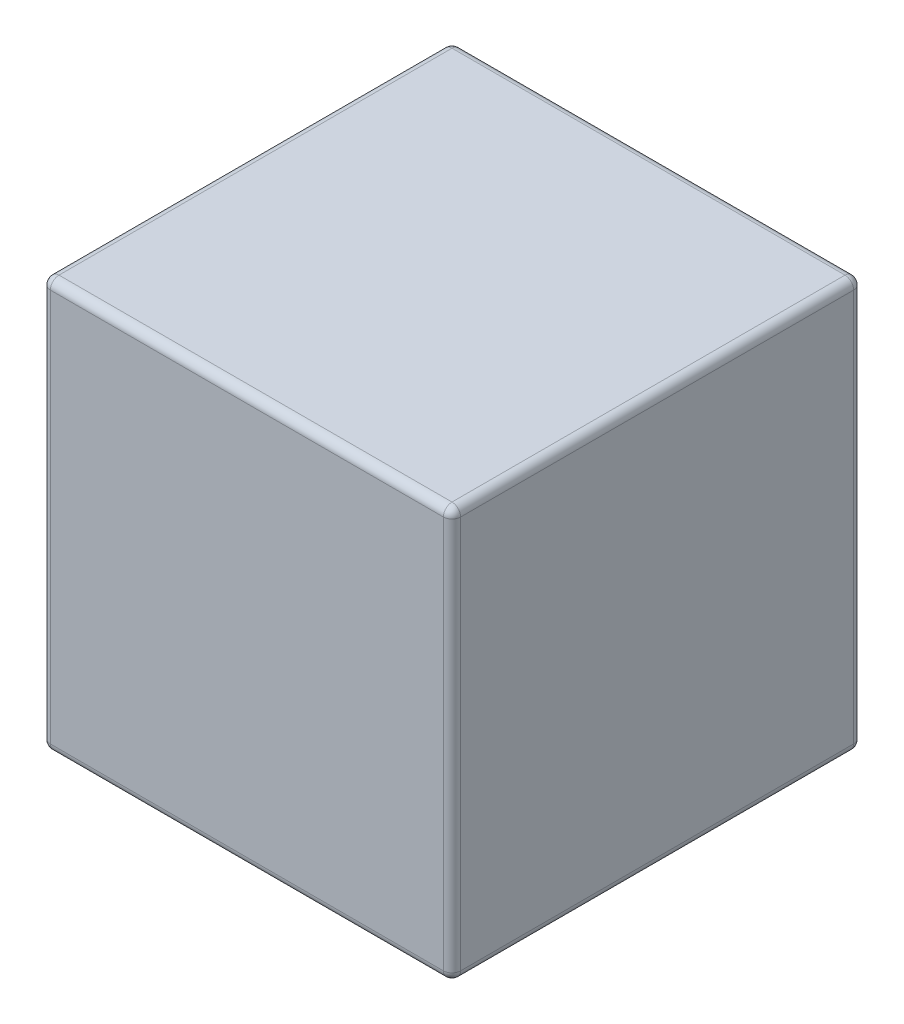
ISO-10303-21;
HEADER;
FILE_DESCRIPTION(('STEP AP214'),'2;1');
FILE_NAME('part.step','',(''),(''),'','','');
FILE_SCHEMA(('AUTOMOTIVE_DESIGN { 1 0 10303 214 1 1 1 1 }'));
ENDSEC;
DATA;
#1=APPLICATION_CONTEXT('core data for automotive mechanical design processes');
#2=APPLICATION_PROTOCOL_DEFINITION('international standard','automotive_design',2000,#1);
#3=PRODUCT_CONTEXT('',#1,'mechanical');
#4=PRODUCT('Part','Part','',(#3));
#5=PRODUCT_RELATED_PRODUCT_CATEGORY('part','',(#4));
#6=PRODUCT_DEFINITION_FORMATION('','',#4);
#7=PRODUCT_DEFINITION_CONTEXT('part definition',#1,'design');
#8=PRODUCT_DEFINITION('design','',#6,#7);
#9=PRODUCT_DEFINITION_SHAPE('','',#8);
#10=(LENGTH_UNIT() NAMED_UNIT(*) SI_UNIT(.MILLI.,.METRE.));
#11=(NAMED_UNIT(*) PLANE_ANGLE_UNIT() SI_UNIT($,.RADIAN.));
#12=(NAMED_UNIT(*) SI_UNIT($,.STERADIAN.) SOLID_ANGLE_UNIT());
#13=UNCERTAINTY_MEASURE_WITH_UNIT(LENGTH_MEASURE(1.E-05),#10,'distance_accuracy_value','');
#14=(GEOMETRIC_REPRESENTATION_CONTEXT(3) GLOBAL_UNCERTAINTY_ASSIGNED_CONTEXT((#13)) GLOBAL_UNIT_ASSIGNED_CONTEXT((#10,
#11,#12)) REPRESENTATION_CONTEXT('',''));
#15=CARTESIAN_POINT('',(0.,0.,0.));
#16=DIRECTION('',(0.,0.,1.));
#17=DIRECTION('',(1.,0.,0.));
#18=AXIS2_PLACEMENT_3D('',#15,#16,#17);
#19=CARTESIAN_POINT('',(47.5,95.,47.5));
#20=DIRECTION('',(-1.,0.,0.));
#21=DIRECTION('',(0.,0.,1.));
#22=AXIS2_PLACEMENT_3D('',#19,#20,#21);
#23=PLANE('',#22);
#24=DIRECTION('',(0.,0.,-1.));
#25=VECTOR('',#24,1.);
#26=CARTESIAN_POINT('',(47.5,93.,47.5));
#27=LINE('',#26,#25);
#28=CARTESIAN_POINT('',(47.5,93.,-45.5));
#29=VERTEX_POINT('',#28);
#30=CARTESIAN_POINT('',(47.5,93.,45.5));
#31=VERTEX_POINT('',#30);
#32=EDGE_CURVE('E176',#29,#31,#27,.F.);
#33=ORIENTED_EDGE('',*,*,#32,.T.);
#34=DIRECTION('',(0.,-1.,0.));
#35=VECTOR('',#34,1.);
#36=CARTESIAN_POINT('',(47.5,95.,45.5));
#37=LINE('',#36,#35);
#38=CARTESIAN_POINT('',(47.5,2.,45.5));
#39=VERTEX_POINT('',#38);
#40=EDGE_CURVE('E143',#31,#39,#37,.T.);
#41=ORIENTED_EDGE('',*,*,#40,.T.);
#42=DIRECTION('',(0.,0.,-1.));
#43=VECTOR('',#42,1.);
#44=CARTESIAN_POINT('',(47.5,2.,-47.5));
#45=LINE('',#44,#43);
#46=CARTESIAN_POINT('',(47.5,2.,-45.5));
#47=VERTEX_POINT('',#46);
#48=EDGE_CURVE('E180',#39,#47,#45,.T.);
#49=ORIENTED_EDGE('',*,*,#48,.T.);
#50=DIRECTION('',(0.,-1.,0.));
#51=VECTOR('',#50,1.);
#52=CARTESIAN_POINT('',(47.5,95.,-45.5));
#53=LINE('',#52,#51);
#54=EDGE_CURVE('E178',#47,#29,#53,.F.);
#55=ORIENTED_EDGE('',*,*,#54,.T.);
#56=EDGE_LOOP('',(#33,#41,#49,#55));
#57=FACE_BOUND('',#56,.T.);
#58=ADVANCED_FACE('F35',(#57),#23,.F.);
#59=CARTESIAN_POINT('',(-47.5,95.,-47.5));
#60=DIRECTION('',(0.,0.,1.));
#61=DIRECTION('',(1.,0.,0.));
#62=AXIS2_PLACEMENT_3D('',#59,#60,#61);
#63=PLANE('',#62);
#64=DIRECTION('',(0.,-1.,0.));
#65=VECTOR('',#64,1.);
#66=CARTESIAN_POINT('',(45.5,95.,-47.5));
#67=LINE('',#66,#65);
#68=CARTESIAN_POINT('',(45.5,93.,-47.5));
#69=VERTEX_POINT('',#68);
#70=CARTESIAN_POINT('',(45.5,2.,-47.5));
#71=VERTEX_POINT('',#70);
#72=EDGE_CURVE('E196',#69,#71,#67,.T.);
#73=ORIENTED_EDGE('',*,*,#72,.T.);
#74=DIRECTION('',(-1.,0.,0.));
#75=VECTOR('',#74,1.);
#76=CARTESIAN_POINT('',(-47.5,2.,-47.5));
#77=LINE('',#76,#75);
#78=CARTESIAN_POINT('',(-45.5,2.,-47.5));
#79=VERTEX_POINT('',#78);
#80=EDGE_CURVE('E199',#71,#79,#77,.T.);
#81=ORIENTED_EDGE('',*,*,#80,.T.);
#82=DIRECTION('',(0.,-1.,0.));
#83=VECTOR('',#82,1.);
#84=CARTESIAN_POINT('',(-45.5,95.,-47.5));
#85=LINE('',#84,#83);
#86=CARTESIAN_POINT('',(-45.5,93.,-47.5));
#87=VERTEX_POINT('',#86);
#88=EDGE_CURVE('E194',#79,#87,#85,.F.);
#89=ORIENTED_EDGE('',*,*,#88,.T.);
#90=DIRECTION('',(-1.,0.,0.));
#91=VECTOR('',#90,1.);
#92=CARTESIAN_POINT('',(-47.5,93.,-47.5));
#93=LINE('',#92,#91);
#94=EDGE_CURVE('E192',#87,#69,#93,.F.);
#95=ORIENTED_EDGE('',*,*,#94,.T.);
#96=EDGE_LOOP('',(#73,#81,#89,#95));
#97=FACE_BOUND('',#96,.T.);
#98=ADVANCED_FACE('F277',(#97),#63,.F.);
#99=CARTESIAN_POINT('',(-47.5,95.,47.5));
#100=DIRECTION('',(1.,0.,0.));
#101=DIRECTION('',(0.,0.,-1.));
#102=AXIS2_PLACEMENT_3D('',#99,#100,#101);
#103=PLANE('',#102);
#104=DIRECTION('',(0.,0.,1.));
#105=VECTOR('',#104,1.);
#106=CARTESIAN_POINT('',(-47.5,2.,47.5));
#107=LINE('',#106,#105);
#108=CARTESIAN_POINT('',(-47.5,2.,-45.5));
#109=VERTEX_POINT('',#108);
#110=CARTESIAN_POINT('',(-47.5,2.,45.5));
#111=VERTEX_POINT('',#110);
#112=EDGE_CURVE('E171',#109,#111,#107,.T.);
#113=ORIENTED_EDGE('',*,*,#112,.T.);
#114=DIRECTION('',(0.,-1.,0.));
#115=VECTOR('',#114,1.);
#116=CARTESIAN_POINT('',(-47.5,95.,45.5));
#117=LINE('',#116,#115);
#118=CARTESIAN_POINT('',(-47.5,93.,45.5));
#119=VERTEX_POINT('',#118);
#120=EDGE_CURVE('E173',#111,#119,#117,.F.);
#121=ORIENTED_EDGE('',*,*,#120,.T.);
#122=DIRECTION('',(0.,0.,1.));
#123=VECTOR('',#122,1.);
#124=CARTESIAN_POINT('',(-47.5,93.,47.5));
#125=LINE('',#124,#123);
#126=CARTESIAN_POINT('',(-47.5,93.,-45.5));
#127=VERTEX_POINT('',#126);
#128=EDGE_CURVE('E167',#119,#127,#125,.F.);
#129=ORIENTED_EDGE('',*,*,#128,.T.);
#130=DIRECTION('',(0.,-1.,0.));
#131=VECTOR('',#130,1.);
#132=CARTESIAN_POINT('',(-47.5,95.,-45.5));
#133=LINE('',#132,#131);
#134=EDGE_CURVE('E169',#127,#109,#133,.T.);
#135=ORIENTED_EDGE('',*,*,#134,.T.);
#136=EDGE_LOOP('',(#113,#121,#129,#135));
#137=FACE_BOUND('',#136,.T.);
#138=ADVANCED_FACE('F304',(#137),#103,.F.);
#139=CARTESIAN_POINT('',(-47.5,95.,47.5));
#140=DIRECTION('',(0.,0.,-1.));
#141=DIRECTION('',(-1.,0.,0.));
#142=AXIS2_PLACEMENT_3D('',#139,#140,#141);
#143=PLANE('',#142);
#144=DIRECTION('',(0.,-1.,0.));
#145=VECTOR('',#144,1.);
#146=CARTESIAN_POINT('',(-45.5,95.,47.5));
#147=LINE('',#146,#145);
#148=CARTESIAN_POINT('',(-45.5,93.,47.5));
#149=VERTEX_POINT('',#148);
#150=CARTESIAN_POINT('',(-45.5,2.,47.5));
#151=VERTEX_POINT('',#150);
#152=EDGE_CURVE('E135',#149,#151,#147,.T.);
#153=ORIENTED_EDGE('',*,*,#152,.T.);
#154=DIRECTION('',(1.,0.,0.));
#155=VECTOR('',#154,1.);
#156=CARTESIAN_POINT('',(47.5,2.,47.5));
#157=LINE('',#156,#155);
#158=CARTESIAN_POINT('',(45.5,2.,47.5));
#159=VERTEX_POINT('',#158);
#160=EDGE_CURVE('E131',#151,#159,#157,.T.);
#161=ORIENTED_EDGE('',*,*,#160,.T.);
#162=DIRECTION('',(0.,-1.,0.));
#163=VECTOR('',#162,1.);
#164=CARTESIAN_POINT('',(45.5,95.,47.5));
#165=LINE('',#164,#163);
#166=CARTESIAN_POINT('',(45.5,93.,47.5));
#167=VERTEX_POINT('',#166);
#168=EDGE_CURVE('E123',#159,#167,#165,.F.);
#169=ORIENTED_EDGE('',*,*,#168,.T.);
#170=DIRECTION('',(1.,0.,0.));
#171=VECTOR('',#170,1.);
#172=CARTESIAN_POINT('',(-47.5,93.,47.5));
#173=LINE('',#172,#171);
#174=EDGE_CURVE('E128',#167,#149,#173,.F.);
#175=ORIENTED_EDGE('',*,*,#174,.T.);
#176=EDGE_LOOP('',(#153,#161,#169,#175));
#177=FACE_BOUND('',#176,.T.);
#178=ADVANCED_FACE('F126',(#177),#143,.F.);
#179=CARTESIAN_POINT('',(0.,95.,0.));
#180=DIRECTION('',(0.,-1.,0.));
#181=DIRECTION('',(0.,0.,-1.));
#182=AXIS2_PLACEMENT_3D('',#179,#180,#181);
#183=PLANE('',#182);
#184=DIRECTION('',(0.,0.,1.));
#185=VECTOR('',#184,1.);
#186=CARTESIAN_POINT('',(-45.5,95.,0.));
#187=LINE('',#186,#185);
#188=CARTESIAN_POINT('',(-45.5,95.,-45.5));
#189=VERTEX_POINT('',#188);
#190=CARTESIAN_POINT('',(-45.5,95.,45.5));
#191=VERTEX_POINT('',#190);
#192=EDGE_CURVE('E44',#189,#191,#187,.T.);
#193=ORIENTED_EDGE('',*,*,#192,.T.);
#194=DIRECTION('',(1.,0.,0.));
#195=VECTOR('',#194,1.);
#196=CARTESIAN_POINT('',(0.,95.,45.5));
#197=LINE('',#196,#195);
#198=CARTESIAN_POINT('',(45.5,95.,45.5));
#199=VERTEX_POINT('',#198);
#200=EDGE_CURVE('E11',#191,#199,#197,.T.);
#201=ORIENTED_EDGE('',*,*,#200,.T.);
#202=DIRECTION('',(0.,0.,-1.));
#203=VECTOR('',#202,1.);
#204=CARTESIAN_POINT('',(45.5,95.,0.));
#205=LINE('',#204,#203);
#206=CARTESIAN_POINT('',(45.5,95.,-45.5));
#207=VERTEX_POINT('',#206);
#208=EDGE_CURVE('E201',#199,#207,#205,.T.);
#209=ORIENTED_EDGE('',*,*,#208,.T.);
#210=DIRECTION('',(-1.,0.,0.));
#211=VECTOR('',#210,1.);
#212=CARTESIAN_POINT('',(0.,95.,-45.5));
#213=LINE('',#212,#211);
#214=EDGE_CURVE('E55',#207,#189,#213,.T.);
#215=ORIENTED_EDGE('',*,*,#214,.T.);
#216=EDGE_LOOP('',(#193,#201,#209,#215));
#217=FACE_BOUND('',#216,.T.);
#218=ADVANCED_FACE('F366',(#217),#183,.F.);
#219=CARTESIAN_POINT('',(0.,0.,0.));
#220=DIRECTION('',(0.,-1.,0.));
#221=DIRECTION('',(0.,0.,-1.));
#222=AXIS2_PLACEMENT_3D('',#219,#220,#221);
#223=PLANE('',#222);
#224=DIRECTION('',(1.,0.,0.));
#225=VECTOR('',#224,1.);
#226=CARTESIAN_POINT('',(-47.5,0.,45.5));
#227=LINE('',#226,#225);
#228=CARTESIAN_POINT('',(45.5,0.,45.5));
#229=VERTEX_POINT('',#228);
#230=CARTESIAN_POINT('',(-45.5,0.,45.5));
#231=VERTEX_POINT('',#230);
#232=EDGE_CURVE('E187',#229,#231,#227,.F.);
#233=ORIENTED_EDGE('',*,*,#232,.T.);
#234=DIRECTION('',(0.,0.,1.));
#235=VECTOR('',#234,1.);
#236=CARTESIAN_POINT('',(-45.5,0.,-47.5));
#237=LINE('',#236,#235);
#238=CARTESIAN_POINT('',(-45.5,0.,-45.5));
#239=VERTEX_POINT('',#238);
#240=EDGE_CURVE('E189',#231,#239,#237,.F.);
#241=ORIENTED_EDGE('',*,*,#240,.T.);
#242=DIRECTION('',(-1.,0.,0.));
#243=VECTOR('',#242,1.);
#244=CARTESIAN_POINT('',(47.5,0.,-45.5));
#245=LINE('',#244,#243);
#246=CARTESIAN_POINT('',(45.5,0.,-45.5));
#247=VERTEX_POINT('',#246);
#248=EDGE_CURVE('E183',#239,#247,#245,.F.);
#249=ORIENTED_EDGE('',*,*,#248,.T.);
#250=DIRECTION('',(0.,0.,-1.));
#251=VECTOR('',#250,1.);
#252=CARTESIAN_POINT('',(45.5,0.,47.5));
#253=LINE('',#252,#251);
#254=EDGE_CURVE('E185',#247,#229,#253,.F.);
#255=ORIENTED_EDGE('',*,*,#254,.T.);
#256=EDGE_LOOP('',(#233,#241,#249,#255));
#257=FACE_BOUND('',#256,.T.);
#258=ADVANCED_FACE('F268',(#257),#223,.T.);
#259=CARTESIAN_POINT('',(45.5,95.,-45.5));
#260=DIRECTION('',(0.,-1.,0.));
#261=DIRECTION('',(0.,0.,-1.));
#262=AXIS2_PLACEMENT_3D('',#259,#260,#261);
#263=CYLINDRICAL_SURFACE('',#262,2.);
#264=CARTESIAN_POINT('',(45.5,93.,-45.5));
#265=DIRECTION('',(0.,1.,0.));
#266=DIRECTION('',(0.,0.,1.));
#267=AXIS2_PLACEMENT_3D('',#264,#265,#266);
#268=CIRCLE('',#267,2.);
#269=EDGE_CURVE('E39',#29,#69,#268,.T.);
#270=ORIENTED_EDGE('',*,*,#269,.F.);
#271=ORIENTED_EDGE('',*,*,#54,.F.);
#272=CARTESIAN_POINT('',(45.5,2.,-45.5));
#273=DIRECTION('',(0.,-1.,0.));
#274=DIRECTION('',(0.,0.,-1.));
#275=AXIS2_PLACEMENT_3D('',#272,#273,#274);
#276=CIRCLE('',#275,2.);
#277=EDGE_CURVE('E163',#71,#47,#276,.T.);
#278=ORIENTED_EDGE('',*,*,#277,.F.);
#279=ORIENTED_EDGE('',*,*,#72,.F.);
#280=EDGE_LOOP('',(#270,#271,#278,#279));
#281=FACE_BOUND('',#280,.T.);
#282=ADVANCED_FACE('F37',(#281),#263,.T.);
#283=CARTESIAN_POINT('',(45.5,93.,-45.5));
#284=DIRECTION('',(0.,0.,1.));
#285=DIRECTION('',(1.,0.,0.));
#286=AXIS2_PLACEMENT_3D('',#283,#284,#285);
#287=SPHERICAL_SURFACE('',#286,2.);
#288=CARTESIAN_POINT('',(45.5,93.,-45.5));
#289=DIRECTION('',(0.,0.,-1.));
#290=DIRECTION('',(-1.,0.,0.));
#291=AXIS2_PLACEMENT_3D('',#288,#289,#290);
#292=CIRCLE('',#291,2.);
#293=EDGE_CURVE('E247',#29,#207,#292,.F.);
#294=ORIENTED_EDGE('',*,*,#293,.F.);
#295=ORIENTED_EDGE('',*,*,#269,.T.);
#296=CARTESIAN_POINT('',(45.5,93.,-45.5));
#297=DIRECTION('',(1.,0.,0.));
#298=DIRECTION('',(0.,0.,-1.));
#299=AXIS2_PLACEMENT_3D('',#296,#297,#298);
#300=CIRCLE('',#299,2.);
#301=EDGE_CURVE('E250',#207,#69,#300,.F.);
#302=ORIENTED_EDGE('',*,*,#301,.F.);
#303=EDGE_LOOP('',(#294,#295,#302));
#304=FACE_BOUND('',#303,.T.);
#305=ADVANCED_FACE('F294',(#304),#287,.T.);
#306=CARTESIAN_POINT('',(45.5,2.,-45.5));
#307=DIRECTION('',(0.,0.,1.));
#308=DIRECTION('',(1.,0.,0.));
#309=AXIS2_PLACEMENT_3D('',#306,#307,#308);
#310=SPHERICAL_SURFACE('',#309,2.);
#311=CARTESIAN_POINT('',(45.5,2.,-45.5));
#312=DIRECTION('',(1.,0.,0.));
#313=DIRECTION('',(0.,0.,-1.));
#314=AXIS2_PLACEMENT_3D('',#311,#312,#313);
#315=CIRCLE('',#314,2.);
#316=EDGE_CURVE('E241',#71,#247,#315,.F.);
#317=ORIENTED_EDGE('',*,*,#316,.F.);
#318=ORIENTED_EDGE('',*,*,#277,.T.);
#319=CARTESIAN_POINT('',(45.5,2.,-45.5));
#320=DIRECTION('',(0.,0.,-1.));
#321=DIRECTION('',(-1.,0.,0.));
#322=AXIS2_PLACEMENT_3D('',#319,#320,#321);
#323=CIRCLE('',#322,2.);
#324=EDGE_CURVE('E244',#247,#47,#323,.F.);
#325=ORIENTED_EDGE('',*,*,#324,.F.);
#326=EDGE_LOOP('',(#317,#318,#325));
#327=FACE_BOUND('',#326,.T.);
#328=ADVANCED_FACE('F257',(#327),#310,.T.);
#329=CARTESIAN_POINT('',(0.,93.,-45.5));
#330=DIRECTION('',(-1.,0.,0.));
#331=DIRECTION('',(0.,0.,1.));
#332=AXIS2_PLACEMENT_3D('',#329,#330,#331);
#333=CYLINDRICAL_SURFACE('',#332,2.);
#334=ORIENTED_EDGE('',*,*,#301,.T.);
#335=ORIENTED_EDGE('',*,*,#94,.F.);
#336=CARTESIAN_POINT('',(-45.5,93.,-45.5));
#337=DIRECTION('',(-1.,0.,0.));
#338=DIRECTION('',(0.,0.,1.));
#339=AXIS2_PLACEMENT_3D('',#336,#337,#338);
#340=CIRCLE('',#339,2.);
#341=EDGE_CURVE('E235',#189,#87,#340,.T.);
#342=ORIENTED_EDGE('',*,*,#341,.F.);
#343=ORIENTED_EDGE('',*,*,#214,.F.);
#344=EDGE_LOOP('',(#334,#335,#342,#343));
#345=FACE_BOUND('',#344,.T.);
#346=ADVANCED_FACE('F289',(#345),#333,.T.);
#347=CARTESIAN_POINT('',(45.5,93.,0.));
#348=DIRECTION('',(0.,0.,-1.));
#349=DIRECTION('',(-1.,0.,0.));
#350=AXIS2_PLACEMENT_3D('',#347,#348,#349);
#351=CYLINDRICAL_SURFACE('',#350,2.);
#352=ORIENTED_EDGE('',*,*,#293,.T.);
#353=ORIENTED_EDGE('',*,*,#208,.F.);
#354=CARTESIAN_POINT('',(45.5,93.,45.5));
#355=DIRECTION('',(0.,0.,1.));
#356=DIRECTION('',(1.,0.,0.));
#357=AXIS2_PLACEMENT_3D('',#354,#355,#356);
#358=CIRCLE('',#357,2.);
#359=EDGE_CURVE('E147',#31,#199,#358,.T.);
#360=ORIENTED_EDGE('',*,*,#359,.F.);
#361=ORIENTED_EDGE('',*,*,#32,.F.);
#362=EDGE_LOOP('',(#352,#353,#360,#361));
#363=FACE_BOUND('',#362,.T.);
#364=ADVANCED_FACE('F297',(#363),#351,.T.);
#365=CARTESIAN_POINT('',(45.5,95.,45.5));
#366=DIRECTION('',(0.,-1.,0.));
#367=DIRECTION('',(0.,0.,-1.));
#368=AXIS2_PLACEMENT_3D('',#365,#366,#367);
#369=CYLINDRICAL_SURFACE('',#368,2.);
#370=CARTESIAN_POINT('',(45.5,2.,45.5));
#371=DIRECTION('',(0.,-1.,0.));
#372=DIRECTION('',(0.,0.,-1.));
#373=AXIS2_PLACEMENT_3D('',#370,#371,#372);
#374=CIRCLE('',#373,2.);
#375=EDGE_CURVE('E148',#39,#159,#374,.T.);
#376=ORIENTED_EDGE('',*,*,#375,.F.);
#377=ORIENTED_EDGE('',*,*,#40,.F.);
#378=CARTESIAN_POINT('',(45.5,93.,45.5));
#379=DIRECTION('',(0.,1.,0.));
#380=DIRECTION('',(0.,0.,1.));
#381=AXIS2_PLACEMENT_3D('',#378,#379,#380);
#382=CIRCLE('',#381,2.);
#383=EDGE_CURVE('E139',#167,#31,#382,.T.);
#384=ORIENTED_EDGE('',*,*,#383,.F.);
#385=ORIENTED_EDGE('',*,*,#168,.F.);
#386=EDGE_LOOP('',(#376,#377,#384,#385));
#387=FACE_BOUND('',#386,.T.);
#388=ADVANCED_FACE('F141',(#387),#369,.T.);
#389=CARTESIAN_POINT('',(45.5,2.,47.5));
#390=DIRECTION('',(0.,0.,1.));
#391=DIRECTION('',(1.,0.,0.));
#392=AXIS2_PLACEMENT_3D('',#389,#390,#391);
#393=CYLINDRICAL_SURFACE('',#392,2.);
#394=ORIENTED_EDGE('',*,*,#324,.T.);
#395=ORIENTED_EDGE('',*,*,#48,.F.);
#396=CARTESIAN_POINT('',(45.5,2.,45.5));
#397=DIRECTION('',(0.,0.,1.));
#398=DIRECTION('',(1.,0.,0.));
#399=AXIS2_PLACEMENT_3D('',#396,#397,#398);
#400=CIRCLE('',#399,2.);
#401=EDGE_CURVE('E231',#229,#39,#400,.T.);
#402=ORIENTED_EDGE('',*,*,#401,.F.);
#403=ORIENTED_EDGE('',*,*,#254,.F.);
#404=EDGE_LOOP('',(#394,#395,#402,#403));
#405=FACE_BOUND('',#404,.T.);
#406=ADVANCED_FACE('F264',(#405),#393,.T.);
#407=CARTESIAN_POINT('',(-47.5,2.,-45.5));
#408=DIRECTION('',(1.,0.,0.));
#409=DIRECTION('',(0.,0.,-1.));
#410=AXIS2_PLACEMENT_3D('',#407,#408,#409);
#411=CYLINDRICAL_SURFACE('',#410,2.);
#412=ORIENTED_EDGE('',*,*,#316,.T.);
#413=ORIENTED_EDGE('',*,*,#248,.F.);
#414=CARTESIAN_POINT('',(-45.5,2.,-45.5));
#415=DIRECTION('',(-1.,0.,0.));
#416=DIRECTION('',(0.,0.,1.));
#417=AXIS2_PLACEMENT_3D('',#414,#415,#416);
#418=CIRCLE('',#417,2.);
#419=EDGE_CURVE('E228',#79,#239,#418,.T.);
#420=ORIENTED_EDGE('',*,*,#419,.F.);
#421=ORIENTED_EDGE('',*,*,#80,.F.);
#422=EDGE_LOOP('',(#412,#413,#420,#421));
#423=FACE_BOUND('',#422,.T.);
#424=ADVANCED_FACE('F274',(#423),#411,.T.);
#425=CARTESIAN_POINT('',(-45.5,95.,-45.5));
#426=DIRECTION('',(0.,-1.,0.));
#427=DIRECTION('',(0.,0.,-1.));
#428=AXIS2_PLACEMENT_3D('',#425,#426,#427);
#429=CYLINDRICAL_SURFACE('',#428,2.);
#430=CARTESIAN_POINT('',(-45.5,93.,-45.5));
#431=DIRECTION('',(0.,1.,0.));
#432=DIRECTION('',(0.,0.,1.));
#433=AXIS2_PLACEMENT_3D('',#430,#431,#432);
#434=CIRCLE('',#433,2.);
#435=EDGE_CURVE('E238',#87,#127,#434,.T.);
#436=ORIENTED_EDGE('',*,*,#435,.F.);
#437=ORIENTED_EDGE('',*,*,#88,.F.);
#438=CARTESIAN_POINT('',(-45.5,2.,-45.5));
#439=DIRECTION('',(0.,-1.,0.));
#440=DIRECTION('',(0.,0.,-1.));
#441=AXIS2_PLACEMENT_3D('',#438,#439,#440);
#442=CIRCLE('',#441,2.);
#443=EDGE_CURVE('E225',#109,#79,#442,.T.);
#444=ORIENTED_EDGE('',*,*,#443,.F.);
#445=ORIENTED_EDGE('',*,*,#134,.F.);
#446=EDGE_LOOP('',(#436,#437,#444,#445));
#447=FACE_BOUND('',#446,.T.);
#448=ADVANCED_FACE('F282',(#447),#429,.T.);
#449=CARTESIAN_POINT('',(-45.5,93.,-45.5));
#450=DIRECTION('',(0.,0.,1.));
#451=DIRECTION('',(1.,0.,0.));
#452=AXIS2_PLACEMENT_3D('',#449,#450,#451);
#453=SPHERICAL_SURFACE('',#452,2.);
#454=ORIENTED_EDGE('',*,*,#341,.T.);
#455=ORIENTED_EDGE('',*,*,#435,.T.);
#456=CARTESIAN_POINT('',(-45.5,93.,-45.5));
#457=DIRECTION('',(0.,0.,-1.));
#458=DIRECTION('',(-1.,0.,0.));
#459=AXIS2_PLACEMENT_3D('',#456,#457,#458);
#460=CIRCLE('',#459,2.);
#461=EDGE_CURVE('E154',#189,#127,#460,.F.);
#462=ORIENTED_EDGE('',*,*,#461,.F.);
#463=EDGE_LOOP('',(#454,#455,#462));
#464=FACE_BOUND('',#463,.T.);
#465=ADVANCED_FACE('F287',(#464),#453,.T.);
#466=CARTESIAN_POINT('',(45.5,93.,45.5));
#467=DIRECTION('',(0.,0.,1.));
#468=DIRECTION('',(1.,0.,0.));
#469=AXIS2_PLACEMENT_3D('',#466,#467,#468);
#470=SPHERICAL_SURFACE('',#469,2.);
#471=ORIENTED_EDGE('',*,*,#383,.T.);
#472=ORIENTED_EDGE('',*,*,#359,.T.);
#473=CARTESIAN_POINT('',(45.5,93.,45.5));
#474=DIRECTION('',(1.,0.,0.));
#475=DIRECTION('',(0.,0.,-1.));
#476=AXIS2_PLACEMENT_3D('',#473,#474,#475);
#477=CIRCLE('',#476,2.);
#478=EDGE_CURVE('E150',#167,#199,#477,.F.);
#479=ORIENTED_EDGE('',*,*,#478,.F.);
#480=EDGE_LOOP('',(#471,#472,#479));
#481=FACE_BOUND('',#480,.T.);
#482=ADVANCED_FACE('F151',(#481),#470,.T.);
#483=CARTESIAN_POINT('',(45.5,2.,45.5));
#484=DIRECTION('',(0.,0.,1.));
#485=DIRECTION('',(1.,0.,0.));
#486=AXIS2_PLACEMENT_3D('',#483,#484,#485);
#487=SPHERICAL_SURFACE('',#486,2.);
#488=ORIENTED_EDGE('',*,*,#401,.T.);
#489=ORIENTED_EDGE('',*,*,#375,.T.);
#490=CARTESIAN_POINT('',(45.5,2.,45.5));
#491=DIRECTION('',(1.,0.,0.));
#492=DIRECTION('',(0.,0.,-1.));
#493=AXIS2_PLACEMENT_3D('',#490,#491,#492);
#494=CIRCLE('',#493,2.);
#495=EDGE_CURVE('E155',#229,#159,#494,.F.);
#496=ORIENTED_EDGE('',*,*,#495,.F.);
#497=EDGE_LOOP('',(#488,#489,#496));
#498=FACE_BOUND('',#497,.T.);
#499=ADVANCED_FACE('F337',(#498),#487,.T.);
#500=CARTESIAN_POINT('',(-45.5,2.,-45.5));
#501=DIRECTION('',(0.,0.,1.));
#502=DIRECTION('',(1.,0.,0.));
#503=AXIS2_PLACEMENT_3D('',#500,#501,#502);
#504=SPHERICAL_SURFACE('',#503,2.);
#505=ORIENTED_EDGE('',*,*,#443,.T.);
#506=ORIENTED_EDGE('',*,*,#419,.T.);
#507=CARTESIAN_POINT('',(-45.5,2.,-45.5));
#508=DIRECTION('',(0.,0.,-1.));
#509=DIRECTION('',(-1.,0.,0.));
#510=AXIS2_PLACEMENT_3D('',#507,#508,#509);
#511=CIRCLE('',#510,2.);
#512=EDGE_CURVE('E219',#109,#239,#511,.F.);
#513=ORIENTED_EDGE('',*,*,#512,.F.);
#514=EDGE_LOOP('',(#505,#506,#513));
#515=FACE_BOUND('',#514,.T.);
#516=ADVANCED_FACE('F333',(#515),#504,.T.);
#517=CARTESIAN_POINT('',(-45.5,93.,0.));
#518=DIRECTION('',(0.,0.,1.));
#519=DIRECTION('',(1.,0.,0.));
#520=AXIS2_PLACEMENT_3D('',#517,#518,#519);
#521=CYLINDRICAL_SURFACE('',#520,2.);
#522=ORIENTED_EDGE('',*,*,#461,.T.);
#523=ORIENTED_EDGE('',*,*,#128,.F.);
#524=CARTESIAN_POINT('',(-45.5,93.,45.5));
#525=DIRECTION('',(0.,0.,1.));
#526=DIRECTION('',(1.,0.,0.));
#527=AXIS2_PLACEMENT_3D('',#524,#525,#526);
#528=CIRCLE('',#527,2.);
#529=EDGE_CURVE('E216',#191,#119,#528,.T.);
#530=ORIENTED_EDGE('',*,*,#529,.F.);
#531=ORIENTED_EDGE('',*,*,#192,.F.);
#532=EDGE_LOOP('',(#522,#523,#530,#531));
#533=FACE_BOUND('',#532,.T.);
#534=ADVANCED_FACE('F330',(#533),#521,.T.);
#535=CARTESIAN_POINT('',(0.,93.,45.5));
#536=DIRECTION('',(1.,0.,0.));
#537=DIRECTION('',(0.,0.,-1.));
#538=AXIS2_PLACEMENT_3D('',#535,#536,#537);
#539=CYLINDRICAL_SURFACE('',#538,2.);
#540=ORIENTED_EDGE('',*,*,#478,.T.);
#541=ORIENTED_EDGE('',*,*,#200,.F.);
#542=CARTESIAN_POINT('',(-45.5,93.,45.5));
#543=DIRECTION('',(-1.,0.,0.));
#544=DIRECTION('',(0.,0.,1.));
#545=AXIS2_PLACEMENT_3D('',#542,#543,#544);
#546=CIRCLE('',#545,2.);
#547=EDGE_CURVE('E159',#149,#191,#546,.T.);
#548=ORIENTED_EDGE('',*,*,#547,.F.);
#549=ORIENTED_EDGE('',*,*,#174,.F.);
#550=EDGE_LOOP('',(#540,#541,#548,#549));
#551=FACE_BOUND('',#550,.T.);
#552=ADVANCED_FACE('F157',(#551),#539,.T.);
#553=CARTESIAN_POINT('',(-47.5,2.,45.5));
#554=DIRECTION('',(-1.,0.,0.));
#555=DIRECTION('',(0.,0.,1.));
#556=AXIS2_PLACEMENT_3D('',#553,#554,#555);
#557=CYLINDRICAL_SURFACE('',#556,2.);
#558=ORIENTED_EDGE('',*,*,#495,.T.);
#559=ORIENTED_EDGE('',*,*,#160,.F.);
#560=CARTESIAN_POINT('',(-45.5,2.,45.5));
#561=DIRECTION('',(-1.,0.,0.));
#562=DIRECTION('',(0.,0.,1.));
#563=AXIS2_PLACEMENT_3D('',#560,#561,#562);
#564=CIRCLE('',#563,2.);
#565=EDGE_CURVE('E212',#231,#151,#564,.T.);
#566=ORIENTED_EDGE('',*,*,#565,.F.);
#567=ORIENTED_EDGE('',*,*,#232,.F.);
#568=EDGE_LOOP('',(#558,#559,#566,#567));
#569=FACE_BOUND('',#568,.T.);
#570=ADVANCED_FACE('F323',(#569),#557,.T.);
#571=CARTESIAN_POINT('',(-45.5,2.,47.5));
#572=DIRECTION('',(0.,0.,-1.));
#573=DIRECTION('',(-1.,0.,0.));
#574=AXIS2_PLACEMENT_3D('',#571,#572,#573);
#575=CYLINDRICAL_SURFACE('',#574,2.);
#576=ORIENTED_EDGE('',*,*,#512,.T.);
#577=ORIENTED_EDGE('',*,*,#240,.F.);
#578=CARTESIAN_POINT('',(-45.5,2.,45.5));
#579=DIRECTION('',(0.,0.,1.));
#580=DIRECTION('',(1.,0.,0.));
#581=AXIS2_PLACEMENT_3D('',#578,#579,#580);
#582=CIRCLE('',#581,2.);
#583=EDGE_CURVE('E209',#111,#231,#582,.T.);
#584=ORIENTED_EDGE('',*,*,#583,.F.);
#585=ORIENTED_EDGE('',*,*,#112,.F.);
#586=EDGE_LOOP('',(#576,#577,#584,#585));
#587=FACE_BOUND('',#586,.T.);
#588=ADVANCED_FACE('F319',(#587),#575,.T.);
#589=CARTESIAN_POINT('',(-45.5,93.,45.5));
#590=DIRECTION('',(0.,0.,1.));
#591=DIRECTION('',(1.,0.,0.));
#592=AXIS2_PLACEMENT_3D('',#589,#590,#591);
#593=SPHERICAL_SURFACE('',#592,2.);
#594=ORIENTED_EDGE('',*,*,#547,.T.);
#595=ORIENTED_EDGE('',*,*,#529,.T.);
#596=CARTESIAN_POINT('',(-45.5,93.,45.5));
#597=DIRECTION('',(0.,1.,0.));
#598=DIRECTION('',(0.,0.,1.));
#599=AXIS2_PLACEMENT_3D('',#596,#597,#598);
#600=CIRCLE('',#599,2.);
#601=EDGE_CURVE('E207',#149,#119,#600,.F.);
#602=ORIENTED_EDGE('',*,*,#601,.F.);
#603=EDGE_LOOP('',(#594,#595,#602));
#604=FACE_BOUND('',#603,.T.);
#605=ADVANCED_FACE('F315',(#604),#593,.T.);
#606=CARTESIAN_POINT('',(-45.5,2.,45.5));
#607=DIRECTION('',(0.,0.,1.));
#608=DIRECTION('',(1.,0.,0.));
#609=AXIS2_PLACEMENT_3D('',#606,#607,#608);
#610=SPHERICAL_SURFACE('',#609,2.);
#611=ORIENTED_EDGE('',*,*,#583,.T.);
#612=ORIENTED_EDGE('',*,*,#565,.T.);
#613=CARTESIAN_POINT('',(-45.5,2.,45.5));
#614=DIRECTION('',(0.,-1.,0.));
#615=DIRECTION('',(0.,0.,-1.));
#616=AXIS2_PLACEMENT_3D('',#613,#614,#615);
#617=CIRCLE('',#616,2.);
#618=EDGE_CURVE('E205',#111,#151,#617,.F.);
#619=ORIENTED_EDGE('',*,*,#618,.F.);
#620=EDGE_LOOP('',(#611,#612,#619));
#621=FACE_BOUND('',#620,.T.);
#622=ADVANCED_FACE('F311',(#621),#610,.T.);
#623=CARTESIAN_POINT('',(-45.5,95.,45.5));
#624=DIRECTION('',(0.,-1.,0.));
#625=DIRECTION('',(0.,0.,-1.));
#626=AXIS2_PLACEMENT_3D('',#623,#624,#625);
#627=CYLINDRICAL_SURFACE('',#626,2.);
#628=ORIENTED_EDGE('',*,*,#601,.T.);
#629=ORIENTED_EDGE('',*,*,#120,.F.);
#630=ORIENTED_EDGE('',*,*,#618,.T.);
#631=ORIENTED_EDGE('',*,*,#152,.F.);
#632=EDGE_LOOP('',(#628,#629,#630,#631));
#633=FACE_BOUND('',#632,.T.);
#634=ADVANCED_FACE('F308',(#633),#627,.T.);
#635=CLOSED_SHELL('',(#58,#98,#138,#178,#218,#258,#282,#305,#328,#346,#364,#388,#406,#424,#448,
#465,#482,#499,#516,#534,#552,#570,#588,#605,#622,#634));
#636=MANIFOLD_SOLID_BREP('B2',#635);
#637=ADVANCED_BREP_SHAPE_REPRESENTATION('',(#18,#636),#14);
#638=SHAPE_DEFINITION_REPRESENTATION(#9,#637);
ENDSEC;
END-ISO-10303-21;
